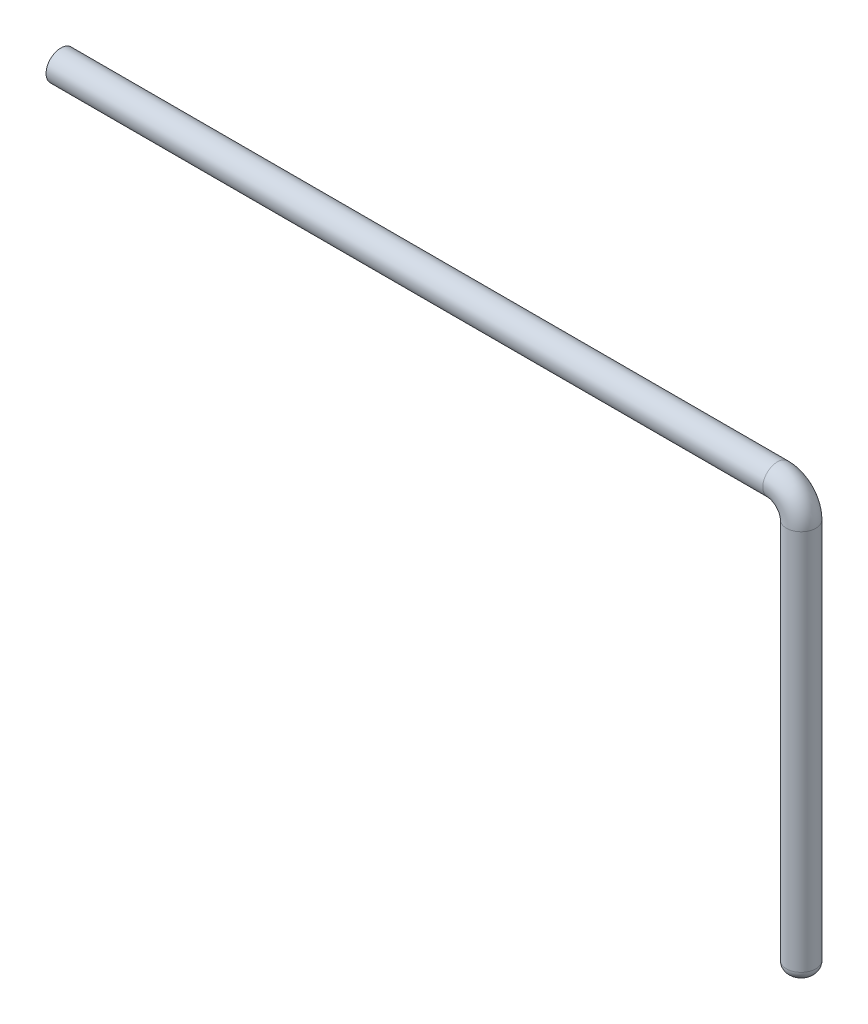
ISO-10303-21;
HEADER;
FILE_DESCRIPTION(('STEP AP214'),'2;1');
FILE_NAME('part.step','',(''),(''),'','','');
FILE_SCHEMA(('AUTOMOTIVE_DESIGN { 1 0 10303 214 1 1 1 1 }'));
ENDSEC;
DATA;
#1=APPLICATION_CONTEXT('core data for automotive mechanical design processes');
#2=APPLICATION_PROTOCOL_DEFINITION('international standard','automotive_design',2000,#1);
#3=PRODUCT_CONTEXT('',#1,'mechanical');
#4=PRODUCT('Part','Part','',(#3));
#5=PRODUCT_RELATED_PRODUCT_CATEGORY('part','',(#4));
#6=PRODUCT_DEFINITION_FORMATION('','',#4);
#7=PRODUCT_DEFINITION_CONTEXT('part definition',#1,'design');
#8=PRODUCT_DEFINITION('design','',#6,#7);
#9=PRODUCT_DEFINITION_SHAPE('','',#8);
#10=(LENGTH_UNIT() NAMED_UNIT(*) SI_UNIT(.MILLI.,.METRE.));
#11=(NAMED_UNIT(*) PLANE_ANGLE_UNIT() SI_UNIT($,.RADIAN.));
#12=(NAMED_UNIT(*) SI_UNIT($,.STERADIAN.) SOLID_ANGLE_UNIT());
#13=UNCERTAINTY_MEASURE_WITH_UNIT(LENGTH_MEASURE(1.E-05),#10,'distance_accuracy_value','');
#14=(GEOMETRIC_REPRESENTATION_CONTEXT(3) GLOBAL_UNCERTAINTY_ASSIGNED_CONTEXT((#13)) GLOBAL_UNIT_ASSIGNED_CONTEXT((#10,
#11,#12)) REPRESENTATION_CONTEXT('',''));
#15=CARTESIAN_POINT('',(0.,0.,0.));
#16=DIRECTION('',(0.,0.,1.));
#17=DIRECTION('',(1.,0.,0.));
#18=AXIS2_PLACEMENT_3D('',#15,#16,#17);
#19=CARTESIAN_POINT('',(36.7076190476191,26.8114285714286,0.));
#20=DIRECTION('',(-1.,0.,0.));
#21=DIRECTION('',(0.,0.,1.));
#22=AXIS2_PLACEMENT_3D('',#19,#20,#21);
#23=PLANE('',#22);
#24=CARTESIAN_POINT('',(36.7076190476191,26.8114285714286,0.));
#25=DIRECTION('',(-1.,0.,0.));
#26=DIRECTION('',(0.,0.,1.));
#27=AXIS2_PLACEMENT_3D('',#24,#25,#26);
#28=CIRCLE('',#27,0.309999999999998);
#29=CARTESIAN_POINT('',(36.7076190476191,26.8114285714286,0.309999999999998));
#30=VERTEX_POINT('',#29);
#31=EDGE_CURVE('E67',#30,#30,#28,.T.);
#32=ORIENTED_EDGE('',*,*,#31,.T.);
#33=EDGE_LOOP('',(#32));
#34=FACE_BOUND('',#33,.T.);
#35=ADVANCED_FACE('F47',(#34),#23,.T.);
#36=CARTESIAN_POINT('',(52.3276190476191,18.0614285714286,0.));
#37=DIRECTION('',(0.,1.,0.));
#38=DIRECTION('',(0.,0.,1.));
#39=AXIS2_PLACEMENT_3D('',#36,#37,#38);
#40=PLANE('',#39);
#41=CARTESIAN_POINT('',(52.3276190476191,18.0614285714286,0.));
#42=DIRECTION('',(0.,1.,0.));
#43=DIRECTION('',(0.,0.,1.));
#44=AXIS2_PLACEMENT_3D('',#41,#42,#43);
#45=CIRCLE('',#44,0.109999999999998);
#46=CARTESIAN_POINT('',(52.3276190476191,18.0614285714286,0.109999999999998));
#47=VERTEX_POINT('',#46);
#48=EDGE_CURVE('E11',#47,#47,#45,.F.);
#49=ORIENTED_EDGE('',*,*,#48,.T.);
#50=EDGE_LOOP('',(#49));
#51=FACE_BOUND('',#50,.T.);
#52=ADVANCED_FACE('F75',(#51),#40,.F.);
#53=CARTESIAN_POINT('',(36.7076190476191,26.8114285714286,0.));
#54=DIRECTION('',(1.,0.,0.));
#55=DIRECTION('',(0.,0.,-1.));
#56=AXIS2_PLACEMENT_3D('',#53,#54,#55);
#57=CYLINDRICAL_SURFACE('',#56,0.309999999999998);
#58=CARTESIAN_POINT('',(51.8276190476191,26.8114285714286,0.));
#59=DIRECTION('',(-1.,0.,0.));
#60=DIRECTION('',(0.,0.,1.));
#61=AXIS2_PLACEMENT_3D('',#58,#59,#60);
#62=CIRCLE('',#61,0.309999999999998);
#63=CARTESIAN_POINT('',(51.8276190476191,27.1214285714286,0.));
#64=VERTEX_POINT('',#63);
#65=EDGE_CURVE('E62',#64,#64,#62,.T.);
#66=ORIENTED_EDGE('',*,*,#65,.T.);
#67=EDGE_LOOP('',(#66));
#68=FACE_BOUND('',#67,.T.);
#69=ORIENTED_EDGE('',*,*,#31,.F.);
#70=EDGE_LOOP('',(#69));
#71=FACE_BOUND('',#70,.T.);
#72=ADVANCED_FACE('F72',(#68,#71),#57,.T.);
#73=CARTESIAN_POINT('',(51.8276190476191,26.3114285714286,0.));
#74=DIRECTION('',(0.,0.,-1.));
#75=DIRECTION('',(-1.,0.,0.));
#76=AXIS2_PLACEMENT_3D('',#73,#74,#75);
#77=TOROIDAL_SURFACE('',#76,0.5,0.309999999999998);
#78=CARTESIAN_POINT('',(52.3276190476191,26.3114285714286,0.));
#79=DIRECTION('',(0.,1.,0.));
#80=DIRECTION('',(0.,0.,1.));
#81=AXIS2_PLACEMENT_3D('',#78,#79,#80);
#82=CIRCLE('',#81,0.309999999999998);
#83=CARTESIAN_POINT('',(52.6376190476191,26.3114285714286,0.));
#84=VERTEX_POINT('',#83);
#85=EDGE_CURVE('E58',#84,#84,#82,.T.);
#86=CARTESIAN_POINT('',(51.8276190476191,26.3114285714286,0.));
#87=DIRECTION('',(0.,0.,-1.));
#88=DIRECTION('',(-1.,0.,0.));
#89=AXIS2_PLACEMENT_3D('',#86,#87,#88);
#90=CIRCLE('',#89,0.809999999999998);
#91=EDGE_CURVE('',#64,#84,#90,.T.);
#92=ORIENTED_EDGE('',*,*,#65,.F.);
#93=ORIENTED_EDGE('',*,*,#85,.T.);
#94=ORIENTED_EDGE('',*,*,#91,.T.);
#95=ORIENTED_EDGE('',*,*,#91,.F.);
#96=EDGE_LOOP('',(#92,#94,#93,#95));
#97=FACE_BOUND('',#96,.T.);
#98=ADVANCED_FACE('F74',(#97),#77,.T.);
#99=CARTESIAN_POINT('',(52.3276190476191,26.3114285714286,0.));
#100=DIRECTION('',(0.,-1.,0.));
#101=DIRECTION('',(0.,0.,-1.));
#102=AXIS2_PLACEMENT_3D('',#99,#100,#101);
#103=CYLINDRICAL_SURFACE('',#102,0.309999999999998);
#104=CARTESIAN_POINT('',(52.3276190476191,18.2614285714286,0.));
#105=DIRECTION('',(0.,1.,0.));
#106=DIRECTION('',(0.,0.,1.));
#107=AXIS2_PLACEMENT_3D('',#104,#105,#106);
#108=CIRCLE('',#107,0.309999999999998);
#109=CARTESIAN_POINT('',(52.3276190476191,18.2614285714286,0.309999999999998));
#110=VERTEX_POINT('',#109);
#111=EDGE_CURVE('E54',#110,#110,#108,.T.);
#112=ORIENTED_EDGE('',*,*,#111,.T.);
#113=EDGE_LOOP('',(#112));
#114=FACE_BOUND('',#113,.T.);
#115=ORIENTED_EDGE('',*,*,#85,.F.);
#116=EDGE_LOOP('',(#115));
#117=FACE_BOUND('',#116,.T.);
#118=ADVANCED_FACE('F82',(#114,#117),#103,.T.);
#119=CARTESIAN_POINT('',(52.3276190476191,18.2614285714286,0.));
#120=DIRECTION('',(0.,1.,0.));
#121=DIRECTION('',(0.,0.,1.));
#122=AXIS2_PLACEMENT_3D('',#119,#120,#121);
#123=DEGENERATE_TOROIDAL_SURFACE('',#122,0.109999999999998,0.2,.T.);
#124=ORIENTED_EDGE('',*,*,#48,.F.);
#125=EDGE_LOOP('',(#124));
#126=FACE_BOUND('',#125,.T.);
#127=ORIENTED_EDGE('',*,*,#111,.F.);
#128=EDGE_LOOP('',(#127));
#129=FACE_BOUND('',#128,.T.);
#130=ADVANCED_FACE('F49',(#126,#129),#123,.T.);
#131=CLOSED_SHELL('',(#35,#52,#72,#98,#118,#130));
#132=MANIFOLD_SOLID_BREP('B2',#131);
#133=ADVANCED_BREP_SHAPE_REPRESENTATION('',(#18,#132),#14);
#134=SHAPE_DEFINITION_REPRESENTATION(#9,#133);
ENDSEC;
END-ISO-10303-21;
